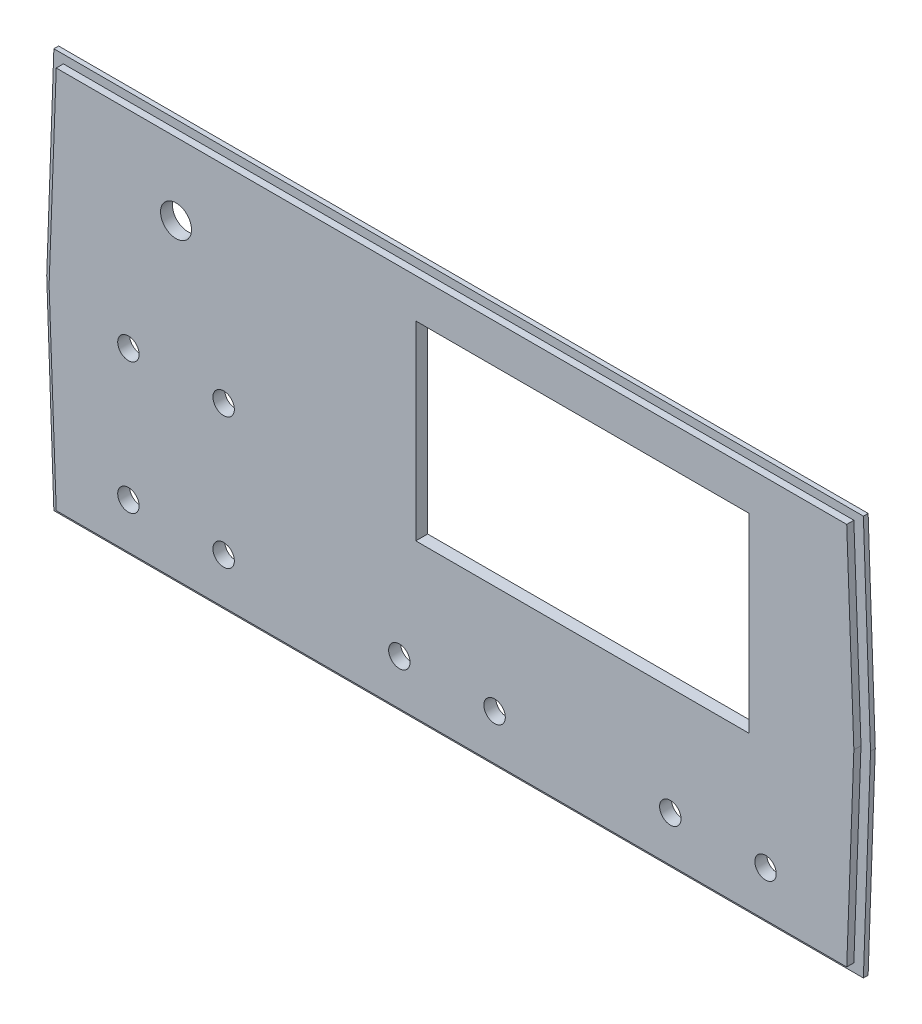
ISO-10303-21;
HEADER;
FILE_DESCRIPTION(('STEP AP214'),'2;1');
FILE_NAME('part.step','',(''),(''),'','','');
FILE_SCHEMA(('AUTOMOTIVE_DESIGN { 1 0 10303 214 1 1 1 1 }'));
ENDSEC;
DATA;
#1=APPLICATION_CONTEXT('core data for automotive mechanical design processes');
#2=APPLICATION_PROTOCOL_DEFINITION('international standard','automotive_design',2000,#1);
#3=PRODUCT_CONTEXT('',#1,'mechanical');
#4=PRODUCT('Part','Part','',(#3));
#5=PRODUCT_RELATED_PRODUCT_CATEGORY('part','',(#4));
#6=PRODUCT_DEFINITION_FORMATION('','',#4);
#7=PRODUCT_DEFINITION_CONTEXT('part definition',#1,'design');
#8=PRODUCT_DEFINITION('design','',#6,#7);
#9=PRODUCT_DEFINITION_SHAPE('','',#8);
#10=(LENGTH_UNIT() NAMED_UNIT(*) SI_UNIT(.MILLI.,.METRE.));
#11=(NAMED_UNIT(*) PLANE_ANGLE_UNIT() SI_UNIT($,.RADIAN.));
#12=(NAMED_UNIT(*) SI_UNIT($,.STERADIAN.) SOLID_ANGLE_UNIT());
#13=UNCERTAINTY_MEASURE_WITH_UNIT(LENGTH_MEASURE(1.E-05),#10,'distance_accuracy_value','');
#14=(GEOMETRIC_REPRESENTATION_CONTEXT(3) GLOBAL_UNCERTAINTY_ASSIGNED_CONTEXT((#13)) GLOBAL_UNIT_ASSIGNED_CONTEXT((#10,
#11,#12)) REPRESENTATION_CONTEXT('',''));
#15=CARTESIAN_POINT('',(0.,0.,0.));
#16=DIRECTION('',(0.,0.,1.));
#17=DIRECTION('',(1.,0.,0.));
#18=AXIS2_PLACEMENT_3D('',#15,#16,#17);
#19=CARTESIAN_POINT('',(0.,0.,1.));
#20=DIRECTION('',(0.,0.,-1.));
#21=DIRECTION('',(-1.,0.,0.));
#22=AXIS2_PLACEMENT_3D('',#19,#20,#21);
#23=PLANE('',#22);
#24=DIRECTION('',(0.0356915305124112,0.99936285434755,0.));
#25=VECTOR('',#24,1.);
#26=CARTESIAN_POINT('',(85.,-42.,1.));
#27=LINE('',#26,#25);
#28=CARTESIAN_POINT('',(85.,-42.,1.));
#29=VERTEX_POINT('',#28);
#30=CARTESIAN_POINT('',(86.5,0.,1.));
#31=VERTEX_POINT('',#30);
#32=EDGE_CURVE('E228',#29,#31,#27,.T.);
#33=ORIENTED_EDGE('',*,*,#32,.T.);
#34=DIRECTION('',(-0.0356915305124112,0.99936285434755,0.));
#35=VECTOR('',#34,1.);
#36=CARTESIAN_POINT('',(85.,42.,1.));
#37=LINE('',#36,#35);
#38=CARTESIAN_POINT('',(85.,42.,1.));
#39=VERTEX_POINT('',#38);
#40=EDGE_CURVE('E231',#31,#39,#37,.T.);
#41=ORIENTED_EDGE('',*,*,#40,.T.);
#42=DIRECTION('',(-1.,0.,0.));
#43=VECTOR('',#42,1.);
#44=CARTESIAN_POINT('',(-85.,42.,1.));
#45=LINE('',#44,#43);
#46=CARTESIAN_POINT('',(-85.,42.,1.));
#47=VERTEX_POINT('',#46);
#48=EDGE_CURVE('E234',#39,#47,#45,.T.);
#49=ORIENTED_EDGE('',*,*,#48,.T.);
#50=DIRECTION('',(-0.0356915305124132,-0.999362854347549,0.));
#51=VECTOR('',#50,1.);
#52=CARTESIAN_POINT('',(-85.,42.,1.));
#53=LINE('',#52,#51);
#54=CARTESIAN_POINT('',(-86.5,0.,1.));
#55=VERTEX_POINT('',#54);
#56=EDGE_CURVE('E236',#47,#55,#53,.T.);
#57=ORIENTED_EDGE('',*,*,#56,.T.);
#58=DIRECTION('',(0.0356915305124132,-0.99936285434755,0.));
#59=VECTOR('',#58,1.);
#60=CARTESIAN_POINT('',(-86.5,0.,1.));
#61=LINE('',#60,#59);
#62=CARTESIAN_POINT('',(-85.,-42.,1.));
#63=VERTEX_POINT('',#62);
#64=EDGE_CURVE('E238',#55,#63,#61,.T.);
#65=ORIENTED_EDGE('',*,*,#64,.T.);
#66=DIRECTION('',(1.,0.,0.));
#67=VECTOR('',#66,1.);
#68=CARTESIAN_POINT('',(-85.,-42.,1.));
#69=LINE('',#68,#67);
#70=EDGE_CURVE('E240',#63,#29,#69,.T.);
#71=ORIENTED_EDGE('',*,*,#70,.T.);
#72=EDGE_LOOP('',(#33,#41,#49,#57,#65,#71));
#73=FACE_BOUND('',#72,.T.);
#74=DIRECTION('',(0.0372412287515797,0.999306304834045,0.));
#75=VECTOR('',#74,1.);
#76=CARTESIAN_POINT('',(83.,-40.25,1.));
#77=LINE('',#76,#75);
#78=CARTESIAN_POINT('',(83.,-40.25,1.));
#79=VERTEX_POINT('',#78);
#80=CARTESIAN_POINT('',(84.5,0.,1.));
#81=VERTEX_POINT('',#80);
#82=EDGE_CURVE('E176',#79,#81,#77,.T.);
#83=ORIENTED_EDGE('',*,*,#82,.F.);
#84=DIRECTION('',(1.,0.,0.));
#85=VECTOR('',#84,1.);
#86=CARTESIAN_POINT('',(-83.,-40.25,1.));
#87=LINE('',#86,#85);
#88=CARTESIAN_POINT('',(-83.,-40.25,1.));
#89=VERTEX_POINT('',#88);
#90=EDGE_CURVE('E183',#89,#79,#87,.T.);
#91=ORIENTED_EDGE('',*,*,#90,.F.);
#92=DIRECTION('',(0.037241228751579,-0.999306304834044,0.));
#93=VECTOR('',#92,1.);
#94=CARTESIAN_POINT('',(-83.,-40.25,1.));
#95=LINE('',#94,#93);
#96=CARTESIAN_POINT('',(-84.5,0.,1.));
#97=VERTEX_POINT('',#96);
#98=EDGE_CURVE('E205',#97,#89,#95,.T.);
#99=ORIENTED_EDGE('',*,*,#98,.F.);
#100=DIRECTION('',(-0.037241228751579,-0.999306304834044,0.));
#101=VECTOR('',#100,1.);
#102=CARTESIAN_POINT('',(-84.5,0.,1.));
#103=LINE('',#102,#101);
#104=CARTESIAN_POINT('',(-83.,40.25,1.));
#105=VERTEX_POINT('',#104);
#106=EDGE_CURVE('E202',#105,#97,#103,.T.);
#107=ORIENTED_EDGE('',*,*,#106,.F.);
#108=DIRECTION('',(-1.,0.,0.));
#109=VECTOR('',#108,1.);
#110=CARTESIAN_POINT('',(-83.,40.25,1.));
#111=LINE('',#110,#109);
#112=CARTESIAN_POINT('',(83.,40.25,1.));
#113=VERTEX_POINT('',#112);
#114=EDGE_CURVE('E199',#113,#105,#111,.T.);
#115=ORIENTED_EDGE('',*,*,#114,.F.);
#116=DIRECTION('',(-0.0372412287515797,0.999306304834045,0.));
#117=VECTOR('',#116,1.);
#118=CARTESIAN_POINT('',(84.5,0.,1.));
#119=LINE('',#118,#117);
#120=EDGE_CURVE('E196',#81,#113,#119,.T.);
#121=ORIENTED_EDGE('',*,*,#120,.F.);
#122=EDGE_LOOP('',(#83,#91,#99,#107,#115,#121));
#123=FACE_BOUND('',#122,.T.);
#124=ADVANCED_FACE('F35',(#73,#123),#23,.F.);
#125=CARTESIAN_POINT('',(85.,-42.,1.));
#126=DIRECTION('',(-0.99936285434755,0.0356915305124112,0.));
#127=DIRECTION('',(-0.0356915305124112,-0.99936285434755,0.));
#128=AXIS2_PLACEMENT_3D('',#125,#126,#127);
#129=PLANE('',#128);
#130=DIRECTION('',(0.0356915305124112,0.99936285434755,0.));
#131=VECTOR('',#130,1.);
#132=CARTESIAN_POINT('',(85.,-42.,0.));
#133=LINE('',#132,#131);
#134=CARTESIAN_POINT('',(85.,-42.,0.));
#135=VERTEX_POINT('',#134);
#136=CARTESIAN_POINT('',(86.5,0.,0.));
#137=VERTEX_POINT('',#136);
#138=EDGE_CURVE('E227',#135,#137,#133,.T.);
#139=ORIENTED_EDGE('',*,*,#138,.T.);
#140=DIRECTION('',(0.,0.,-1.));
#141=VECTOR('',#140,1.);
#142=CARTESIAN_POINT('',(86.5,0.,1.));
#143=LINE('',#142,#141);
#144=EDGE_CURVE('E268',#31,#137,#143,.T.);
#145=ORIENTED_EDGE('',*,*,#144,.F.);
#146=ORIENTED_EDGE('',*,*,#32,.F.);
#147=DIRECTION('',(0.,0.,-1.));
#148=VECTOR('',#147,1.);
#149=CARTESIAN_POINT('',(85.,-42.,1.));
#150=LINE('',#149,#148);
#151=EDGE_CURVE('E242',#29,#135,#150,.T.);
#152=ORIENTED_EDGE('',*,*,#151,.T.);
#153=EDGE_LOOP('',(#139,#145,#146,#152));
#154=FACE_BOUND('',#153,.T.);
#155=ADVANCED_FACE('F37',(#154),#129,.F.);
#156=CARTESIAN_POINT('',(85.,42.,1.));
#157=DIRECTION('',(-0.99936285434755,-0.0356915305124112,0.));
#158=DIRECTION('',(0.0356915305124112,-0.99936285434755,0.));
#159=AXIS2_PLACEMENT_3D('',#156,#157,#158);
#160=PLANE('',#159);
#161=DIRECTION('',(-0.0356915305124112,0.99936285434755,0.));
#162=VECTOR('',#161,1.);
#163=CARTESIAN_POINT('',(85.,42.,0.));
#164=LINE('',#163,#162);
#165=CARTESIAN_POINT('',(85.,42.,0.));
#166=VERTEX_POINT('',#165);
#167=EDGE_CURVE('E245',#137,#166,#164,.T.);
#168=ORIENTED_EDGE('',*,*,#167,.T.);
#169=DIRECTION('',(0.,0.,-1.));
#170=VECTOR('',#169,1.);
#171=CARTESIAN_POINT('',(85.,42.,1.));
#172=LINE('',#171,#170);
#173=EDGE_CURVE('E265',#39,#166,#172,.T.);
#174=ORIENTED_EDGE('',*,*,#173,.F.);
#175=ORIENTED_EDGE('',*,*,#40,.F.);
#176=ORIENTED_EDGE('',*,*,#144,.T.);
#177=EDGE_LOOP('',(#168,#174,#175,#176));
#178=FACE_BOUND('',#177,.T.);
#179=ADVANCED_FACE('F357',(#178),#160,.F.);
#180=CARTESIAN_POINT('',(-85.,42.,1.));
#181=DIRECTION('',(0.,-1.,0.));
#182=DIRECTION('',(0.,0.,-1.));
#183=AXIS2_PLACEMENT_3D('',#180,#181,#182);
#184=PLANE('',#183);
#185=DIRECTION('',(-1.,0.,0.));
#186=VECTOR('',#185,1.);
#187=CARTESIAN_POINT('',(-85.,42.,0.));
#188=LINE('',#187,#186);
#189=CARTESIAN_POINT('',(-85.,42.,0.));
#190=VERTEX_POINT('',#189);
#191=EDGE_CURVE('E247',#166,#190,#188,.T.);
#192=ORIENTED_EDGE('',*,*,#191,.T.);
#193=DIRECTION('',(0.,0.,-1.));
#194=VECTOR('',#193,1.);
#195=CARTESIAN_POINT('',(-85.,42.,1.));
#196=LINE('',#195,#194);
#197=EDGE_CURVE('E262',#47,#190,#196,.T.);
#198=ORIENTED_EDGE('',*,*,#197,.F.);
#199=ORIENTED_EDGE('',*,*,#48,.F.);
#200=ORIENTED_EDGE('',*,*,#173,.T.);
#201=EDGE_LOOP('',(#192,#198,#199,#200));
#202=FACE_BOUND('',#201,.T.);
#203=ADVANCED_FACE('F572',(#202),#184,.F.);
#204=CARTESIAN_POINT('',(-85.,42.,1.));
#205=DIRECTION('',(0.999362854347549,-0.0356915305124132,0.));
#206=DIRECTION('',(0.0356915305124132,0.99936285434755,0.));
#207=AXIS2_PLACEMENT_3D('',#204,#205,#206);
#208=PLANE('',#207);
#209=DIRECTION('',(-0.0356915305124132,-0.999362854347549,0.));
#210=VECTOR('',#209,1.);
#211=CARTESIAN_POINT('',(-85.,42.,0.));
#212=LINE('',#211,#210);
#213=CARTESIAN_POINT('',(-86.5,0.,0.));
#214=VERTEX_POINT('',#213);
#215=EDGE_CURVE('E249',#190,#214,#212,.T.);
#216=ORIENTED_EDGE('',*,*,#215,.T.);
#217=DIRECTION('',(0.,0.,-1.));
#218=VECTOR('',#217,1.);
#219=CARTESIAN_POINT('',(-86.5,0.,1.));
#220=LINE('',#219,#218);
#221=EDGE_CURVE('E259',#55,#214,#220,.T.);
#222=ORIENTED_EDGE('',*,*,#221,.F.);
#223=ORIENTED_EDGE('',*,*,#56,.F.);
#224=ORIENTED_EDGE('',*,*,#197,.T.);
#225=EDGE_LOOP('',(#216,#222,#223,#224));
#226=FACE_BOUND('',#225,.T.);
#227=ADVANCED_FACE('F562',(#226),#208,.F.);
#228=CARTESIAN_POINT('',(-86.5,0.,1.));
#229=DIRECTION('',(0.999362854347549,0.0356915305124132,0.));
#230=DIRECTION('',(-0.0356915305124132,0.99936285434755,0.));
#231=AXIS2_PLACEMENT_3D('',#228,#229,#230);
#232=PLANE('',#231);
#233=DIRECTION('',(0.0356915305124132,-0.99936285434755,0.));
#234=VECTOR('',#233,1.);
#235=CARTESIAN_POINT('',(-86.5,0.,0.));
#236=LINE('',#235,#234);
#237=CARTESIAN_POINT('',(-85.,-42.,0.));
#238=VERTEX_POINT('',#237);
#239=EDGE_CURVE('E251',#214,#238,#236,.T.);
#240=ORIENTED_EDGE('',*,*,#239,.T.);
#241=DIRECTION('',(0.,0.,-1.));
#242=VECTOR('',#241,1.);
#243=CARTESIAN_POINT('',(-85.,-42.,1.));
#244=LINE('',#243,#242);
#245=EDGE_CURVE('E256',#63,#238,#244,.T.);
#246=ORIENTED_EDGE('',*,*,#245,.F.);
#247=ORIENTED_EDGE('',*,*,#64,.F.);
#248=ORIENTED_EDGE('',*,*,#221,.T.);
#249=EDGE_LOOP('',(#240,#246,#247,#248));
#250=FACE_BOUND('',#249,.T.);
#251=ADVANCED_FACE('F346',(#250),#232,.F.);
#252=CARTESIAN_POINT('',(-85.,-42.,1.));
#253=DIRECTION('',(0.,1.,0.));
#254=DIRECTION('',(0.,0.,1.));
#255=AXIS2_PLACEMENT_3D('',#252,#253,#254);
#256=PLANE('',#255);
#257=DIRECTION('',(1.,0.,0.));
#258=VECTOR('',#257,1.);
#259=CARTESIAN_POINT('',(-85.,-42.,0.));
#260=LINE('',#259,#258);
#261=EDGE_CURVE('E232',#238,#135,#260,.T.);
#262=ORIENTED_EDGE('',*,*,#261,.T.);
#263=ORIENTED_EDGE('',*,*,#151,.F.);
#264=ORIENTED_EDGE('',*,*,#70,.F.);
#265=ORIENTED_EDGE('',*,*,#245,.T.);
#266=EDGE_LOOP('',(#262,#263,#264,#265));
#267=FACE_BOUND('',#266,.T.);
#268=ADVANCED_FACE('F336',(#267),#256,.F.);
#269=CARTESIAN_POINT('',(0.,0.,0.));
#270=DIRECTION('',(0.,0.,-1.));
#271=DIRECTION('',(-1.,0.,0.));
#272=AXIS2_PLACEMENT_3D('',#269,#270,#271);
#273=PLANE('',#272);
#274=CARTESIAN_POINT('',(-57.8450229364827,25.0440656120589,0.));
#275=DIRECTION('',(0.,0.,-1.));
#276=DIRECTION('',(-1.,0.,0.));
#277=AXIS2_PLACEMENT_3D('',#274,#275,#276);
#278=CIRCLE('',#277,3.25);
#279=CARTESIAN_POINT('',(-61.0950229364827,25.0440656120589,0.));
#280=VERTEX_POINT('',#279);
#281=EDGE_CURVE('E315',#280,#280,#278,.T.);
#282=ORIENTED_EDGE('',*,*,#281,.F.);
#283=EDGE_LOOP('',(#282));
#284=FACE_BOUND('',#283,.T.);
#285=CARTESIAN_POINT('',(-47.8450229364827,-3.14196392407834,0.));
#286=DIRECTION('',(0.,0.,-1.));
#287=DIRECTION('',(-1.,0.,0.));
#288=AXIS2_PLACEMENT_3D('',#285,#286,#287);
#289=CIRCLE('',#288,2.25);
#290=CARTESIAN_POINT('',(-50.0950229364827,-3.14196392407834,0.));
#291=VERTEX_POINT('',#290);
#292=EDGE_CURVE('E305',#291,#291,#289,.T.);
#293=ORIENTED_EDGE('',*,*,#292,.F.);
#294=EDGE_LOOP('',(#293));
#295=FACE_BOUND('',#294,.T.);
#296=CARTESIAN_POINT('',(-67.8450229364827,-3.14196392407834,0.));
#297=DIRECTION('',(0.,0.,-1.));
#298=DIRECTION('',(-1.,0.,0.));
#299=AXIS2_PLACEMENT_3D('',#296,#297,#298);
#300=CIRCLE('',#299,2.25);
#301=CARTESIAN_POINT('',(-70.0950229364827,-3.14196392407834,0.));
#302=VERTEX_POINT('',#301);
#303=EDGE_CURVE('E302',#302,#302,#300,.T.);
#304=ORIENTED_EDGE('',*,*,#303,.F.);
#305=EDGE_LOOP('',(#304));
#306=FACE_BOUND('',#305,.T.);
#307=CARTESIAN_POINT('',(-67.8450229364827,-30.7059343879411,0.));
#308=DIRECTION('',(0.,0.,-1.));
#309=DIRECTION('',(-1.,0.,0.));
#310=AXIS2_PLACEMENT_3D('',#307,#308,#309);
#311=CIRCLE('',#310,2.25);
#312=CARTESIAN_POINT('',(-70.0950229364827,-30.7059343879411,0.));
#313=VERTEX_POINT('',#312);
#314=EDGE_CURVE('E299',#313,#313,#311,.T.);
#315=ORIENTED_EDGE('',*,*,#314,.F.);
#316=EDGE_LOOP('',(#315));
#317=FACE_BOUND('',#316,.T.);
#318=CARTESIAN_POINT('',(-47.8450229364827,-30.7059343879411,0.));
#319=DIRECTION('',(0.,0.,-1.));
#320=DIRECTION('',(-1.,0.,0.));
#321=AXIS2_PLACEMENT_3D('',#318,#319,#320);
#322=CIRCLE('',#321,2.25);
#323=CARTESIAN_POINT('',(-50.0950229364827,-30.7059343879411,0.));
#324=VERTEX_POINT('',#323);
#325=EDGE_CURVE('E295',#324,#324,#322,.T.);
#326=ORIENTED_EDGE('',*,*,#325,.F.);
#327=EDGE_LOOP('',(#326));
#328=FACE_BOUND('',#327,.T.);
#329=CARTESIAN_POINT('',(-10.9453043424043,-30.7059343879411,0.));
#330=DIRECTION('',(0.,0.,-1.));
#331=DIRECTION('',(-1.,0.,0.));
#332=AXIS2_PLACEMENT_3D('',#329,#330,#331);
#333=CIRCLE('',#332,2.25);
#334=CARTESIAN_POINT('',(-13.1953043424043,-30.7059343879411,0.));
#335=VERTEX_POINT('',#334);
#336=EDGE_CURVE('E291',#335,#335,#333,.T.);
#337=ORIENTED_EDGE('',*,*,#336,.F.);
#338=EDGE_LOOP('',(#337));
#339=FACE_BOUND('',#338,.T.);
#340=CARTESIAN_POINT('',(9.05469565759573,-30.7059343879411,0.));
#341=DIRECTION('',(0.,0.,-1.));
#342=DIRECTION('',(-1.,0.,0.));
#343=AXIS2_PLACEMENT_3D('',#340,#341,#342);
#344=CIRCLE('',#343,2.25);
#345=CARTESIAN_POINT('',(6.80469565759574,-30.7059343879411,0.));
#346=VERTEX_POINT('',#345);
#347=EDGE_CURVE('E287',#346,#346,#344,.T.);
#348=ORIENTED_EDGE('',*,*,#347,.F.);
#349=EDGE_LOOP('',(#348));
#350=FACE_BOUND('',#349,.T.);
#351=CARTESIAN_POINT('',(45.9546956575957,-30.7059343879411,0.));
#352=DIRECTION('',(0.,0.,-1.));
#353=DIRECTION('',(-1.,0.,0.));
#354=AXIS2_PLACEMENT_3D('',#351,#352,#353);
#355=CIRCLE('',#354,2.25);
#356=CARTESIAN_POINT('',(43.7046956575957,-30.7059343879411,0.));
#357=VERTEX_POINT('',#356);
#358=EDGE_CURVE('E283',#357,#357,#355,.T.);
#359=ORIENTED_EDGE('',*,*,#358,.F.);
#360=EDGE_LOOP('',(#359));
#361=FACE_BOUND('',#360,.T.);
#362=CARTESIAN_POINT('',(65.9546956575957,-30.7059343879411,0.));
#363=DIRECTION('',(0.,0.,-1.));
#364=DIRECTION('',(-1.,0.,0.));
#365=AXIS2_PLACEMENT_3D('',#362,#363,#364);
#366=CIRCLE('',#365,2.25);
#367=CARTESIAN_POINT('',(63.7046956575957,-30.7059343879411,0.));
#368=VERTEX_POINT('',#367);
#369=EDGE_CURVE('E279',#368,#368,#366,.T.);
#370=ORIENTED_EDGE('',*,*,#369,.F.);
#371=EDGE_LOOP('',(#370));
#372=FACE_BOUND('',#371,.T.);
#373=DIRECTION('',(0.,1.,0.));
#374=VECTOR('',#373,1.);
#375=CARTESIAN_POINT('',(-7.49999999999995,32.,0.));
#376=LINE('',#375,#374);
#377=CARTESIAN_POINT('',(-7.49999999999995,-8.,0.));
#378=VERTEX_POINT('',#377);
#379=CARTESIAN_POINT('',(-7.49999999999995,32.,0.));
#380=VERTEX_POINT('',#379);
#381=EDGE_CURVE('E52',#378,#380,#376,.T.);
#382=ORIENTED_EDGE('',*,*,#381,.F.);
#383=DIRECTION('',(-1.,0.,0.));
#384=VECTOR('',#383,1.);
#385=CARTESIAN_POINT('',(62.5000000000001,-8.,0.));
#386=LINE('',#385,#384);
#387=CARTESIAN_POINT('',(62.5000000000001,-8.,0.));
#388=VERTEX_POINT('',#387);
#389=EDGE_CURVE('E169',#388,#378,#386,.T.);
#390=ORIENTED_EDGE('',*,*,#389,.F.);
#391=DIRECTION('',(0.,-1.,0.));
#392=VECTOR('',#391,1.);
#393=CARTESIAN_POINT('',(62.5000000000001,32.,0.));
#394=LINE('',#393,#392);
#395=CARTESIAN_POINT('',(62.5000000000001,32.,0.));
#396=VERTEX_POINT('',#395);
#397=EDGE_CURVE('E153',#396,#388,#394,.T.);
#398=ORIENTED_EDGE('',*,*,#397,.F.);
#399=DIRECTION('',(1.,0.,0.));
#400=VECTOR('',#399,1.);
#401=CARTESIAN_POINT('',(62.5000000000001,32.,0.));
#402=LINE('',#401,#400);
#403=EDGE_CURVE('E162',#380,#396,#402,.T.);
#404=ORIENTED_EDGE('',*,*,#403,.F.);
#405=EDGE_LOOP('',(#382,#390,#398,#404));
#406=FACE_BOUND('',#405,.T.);
#407=ORIENTED_EDGE('',*,*,#138,.F.);
#408=ORIENTED_EDGE('',*,*,#261,.F.);
#409=ORIENTED_EDGE('',*,*,#239,.F.);
#410=ORIENTED_EDGE('',*,*,#215,.F.);
#411=ORIENTED_EDGE('',*,*,#191,.F.);
#412=ORIENTED_EDGE('',*,*,#167,.F.);
#413=EDGE_LOOP('',(#407,#408,#409,#410,#411,#412));
#414=FACE_BOUND('',#413,.T.);
#415=ADVANCED_FACE('F166',(#284,#295,#306,#317,#328,#339,#350,#361,#372,#406,#414),#273,.T.);
#416=CARTESIAN_POINT('',(83.,-40.25,2.5));
#417=DIRECTION('',(-0.999306304834044,0.0372412287515797,0.));
#418=DIRECTION('',(-0.0372412287515797,-0.999306304834045,0.));
#419=AXIS2_PLACEMENT_3D('',#416,#417,#418);
#420=PLANE('',#419);
#421=ORIENTED_EDGE('',*,*,#82,.T.);
#422=DIRECTION('',(0.,0.,-1.));
#423=VECTOR('',#422,1.);
#424=CARTESIAN_POINT('',(84.5,0.,2.5));
#425=LINE('',#424,#423);
#426=CARTESIAN_POINT('',(84.5,0.,2.5));
#427=VERTEX_POINT('',#426);
#428=EDGE_CURVE('E224',#427,#81,#425,.T.);
#429=ORIENTED_EDGE('',*,*,#428,.F.);
#430=DIRECTION('',(0.0372412287515797,0.999306304834045,0.));
#431=VECTOR('',#430,1.);
#432=CARTESIAN_POINT('',(83.,-40.25,2.5));
#433=LINE('',#432,#431);
#434=CARTESIAN_POINT('',(83.,-40.25,2.5));
#435=VERTEX_POINT('',#434);
#436=EDGE_CURVE('E179',#435,#427,#433,.T.);
#437=ORIENTED_EDGE('',*,*,#436,.F.);
#438=DIRECTION('',(0.,0.,-1.));
#439=VECTOR('',#438,1.);
#440=CARTESIAN_POINT('',(83.,-40.25,2.5));
#441=LINE('',#440,#439);
#442=EDGE_CURVE('E193',#435,#79,#441,.T.);
#443=ORIENTED_EDGE('',*,*,#442,.T.);
#444=EDGE_LOOP('',(#421,#429,#437,#443));
#445=FACE_BOUND('',#444,.T.);
#446=ADVANCED_FACE('F335',(#445),#420,.F.);
#447=CARTESIAN_POINT('',(84.5,0.,2.5));
#448=DIRECTION('',(-0.999306304834044,-0.0372412287515797,0.));
#449=DIRECTION('',(0.0372412287515797,-0.999306304834045,0.));
#450=AXIS2_PLACEMENT_3D('',#447,#448,#449);
#451=PLANE('',#450);
#452=ORIENTED_EDGE('',*,*,#120,.T.);
#453=DIRECTION('',(0.,0.,-1.));
#454=VECTOR('',#453,1.);
#455=CARTESIAN_POINT('',(83.,40.25,2.5));
#456=LINE('',#455,#454);
#457=CARTESIAN_POINT('',(83.,40.25,2.5));
#458=VERTEX_POINT('',#457);
#459=EDGE_CURVE('E221',#458,#113,#456,.T.);
#460=ORIENTED_EDGE('',*,*,#459,.F.);
#461=DIRECTION('',(-0.0372412287515797,0.999306304834045,0.));
#462=VECTOR('',#461,1.);
#463=CARTESIAN_POINT('',(84.5,0.,2.5));
#464=LINE('',#463,#462);
#465=EDGE_CURVE('E182',#427,#458,#464,.T.);
#466=ORIENTED_EDGE('',*,*,#465,.F.);
#467=ORIENTED_EDGE('',*,*,#428,.T.);
#468=EDGE_LOOP('',(#452,#460,#466,#467));
#469=FACE_BOUND('',#468,.T.);
#470=ADVANCED_FACE('F343',(#469),#451,.F.);
#471=CARTESIAN_POINT('',(-83.,40.25,2.5));
#472=DIRECTION('',(0.,-1.,0.));
#473=DIRECTION('',(0.,0.,-1.));
#474=AXIS2_PLACEMENT_3D('',#471,#472,#473);
#475=PLANE('',#474);
#476=ORIENTED_EDGE('',*,*,#114,.T.);
#477=DIRECTION('',(0.,0.,-1.));
#478=VECTOR('',#477,1.);
#479=CARTESIAN_POINT('',(-83.,40.25,2.5));
#480=LINE('',#479,#478);
#481=CARTESIAN_POINT('',(-83.,40.25,2.5));
#482=VERTEX_POINT('',#481);
#483=EDGE_CURVE('E218',#482,#105,#480,.T.);
#484=ORIENTED_EDGE('',*,*,#483,.F.);
#485=DIRECTION('',(-1.,0.,0.));
#486=VECTOR('',#485,1.);
#487=CARTESIAN_POINT('',(-83.,40.25,2.5));
#488=LINE('',#487,#486);
#489=EDGE_CURVE('E185',#458,#482,#488,.T.);
#490=ORIENTED_EDGE('',*,*,#489,.F.);
#491=ORIENTED_EDGE('',*,*,#459,.T.);
#492=EDGE_LOOP('',(#476,#484,#490,#491));
#493=FACE_BOUND('',#492,.T.);
#494=ADVANCED_FACE('F363',(#493),#475,.F.);
#495=CARTESIAN_POINT('',(-84.5,0.,2.5));
#496=DIRECTION('',(0.999306304834045,-0.037241228751579,0.));
#497=DIRECTION('',(0.037241228751579,0.999306304834045,0.));
#498=AXIS2_PLACEMENT_3D('',#495,#496,#497);
#499=PLANE('',#498);
#500=ORIENTED_EDGE('',*,*,#106,.T.);
#501=DIRECTION('',(0.,0.,-1.));
#502=VECTOR('',#501,1.);
#503=CARTESIAN_POINT('',(-84.5,0.,2.5));
#504=LINE('',#503,#502);
#505=CARTESIAN_POINT('',(-84.5,0.,2.5));
#506=VERTEX_POINT('',#505);
#507=EDGE_CURVE('E215',#506,#97,#504,.T.);
#508=ORIENTED_EDGE('',*,*,#507,.F.);
#509=DIRECTION('',(-0.037241228751579,-0.999306304834044,0.));
#510=VECTOR('',#509,1.);
#511=CARTESIAN_POINT('',(-84.5,0.,2.5));
#512=LINE('',#511,#510);
#513=EDGE_CURVE('E187',#482,#506,#512,.T.);
#514=ORIENTED_EDGE('',*,*,#513,.F.);
#515=ORIENTED_EDGE('',*,*,#483,.T.);
#516=EDGE_LOOP('',(#500,#508,#514,#515));
#517=FACE_BOUND('',#516,.T.);
#518=ADVANCED_FACE('F367',(#517),#499,.F.);
#519=CARTESIAN_POINT('',(-83.,-40.25,2.5));
#520=DIRECTION('',(0.999306304834045,0.037241228751579,0.));
#521=DIRECTION('',(-0.037241228751579,0.999306304834045,0.));
#522=AXIS2_PLACEMENT_3D('',#519,#520,#521);
#523=PLANE('',#522);
#524=ORIENTED_EDGE('',*,*,#98,.T.);
#525=DIRECTION('',(0.,0.,-1.));
#526=VECTOR('',#525,1.);
#527=CARTESIAN_POINT('',(-83.,-40.25,2.5));
#528=LINE('',#527,#526);
#529=CARTESIAN_POINT('',(-83.,-40.25,2.5));
#530=VERTEX_POINT('',#529);
#531=EDGE_CURVE('E212',#530,#89,#528,.T.);
#532=ORIENTED_EDGE('',*,*,#531,.F.);
#533=DIRECTION('',(0.037241228751579,-0.999306304834044,0.));
#534=VECTOR('',#533,1.);
#535=CARTESIAN_POINT('',(-83.,-40.25,2.5));
#536=LINE('',#535,#534);
#537=EDGE_CURVE('E189',#506,#530,#536,.T.);
#538=ORIENTED_EDGE('',*,*,#537,.F.);
#539=ORIENTED_EDGE('',*,*,#507,.T.);
#540=EDGE_LOOP('',(#524,#532,#538,#539));
#541=FACE_BOUND('',#540,.T.);
#542=ADVANCED_FACE('F371',(#541),#523,.F.);
#543=CARTESIAN_POINT('',(-83.,-40.25,2.5));
#544=DIRECTION('',(0.,1.,0.));
#545=DIRECTION('',(0.,0.,1.));
#546=AXIS2_PLACEMENT_3D('',#543,#544,#545);
#547=PLANE('',#546);
#548=ORIENTED_EDGE('',*,*,#90,.T.);
#549=ORIENTED_EDGE('',*,*,#442,.F.);
#550=DIRECTION('',(1.,0.,0.));
#551=VECTOR('',#550,1.);
#552=CARTESIAN_POINT('',(-83.,-40.25,2.5));
#553=LINE('',#552,#551);
#554=EDGE_CURVE('E191',#530,#435,#553,.T.);
#555=ORIENTED_EDGE('',*,*,#554,.F.);
#556=ORIENTED_EDGE('',*,*,#531,.T.);
#557=EDGE_LOOP('',(#548,#549,#555,#556));
#558=FACE_BOUND('',#557,.T.);
#559=ADVANCED_FACE('F375',(#558),#547,.F.);
#560=CARTESIAN_POINT('',(0.,0.,2.5));
#561=DIRECTION('',(0.,0.,-1.));
#562=DIRECTION('',(-1.,0.,0.));
#563=AXIS2_PLACEMENT_3D('',#560,#561,#562);
#564=PLANE('',#563);
#565=CARTESIAN_POINT('',(-57.8450229364827,25.0440656120589,2.5));
#566=DIRECTION('',(0.,0.,-1.));
#567=DIRECTION('',(-1.,0.,0.));
#568=AXIS2_PLACEMENT_3D('',#565,#566,#567);
#569=CIRCLE('',#568,3.25);
#570=CARTESIAN_POINT('',(-61.0950229364827,25.0440656120589,2.5));
#571=VERTEX_POINT('',#570);
#572=EDGE_CURVE('E39',#571,#571,#569,.T.);
#573=ORIENTED_EDGE('',*,*,#572,.T.);
#574=EDGE_LOOP('',(#573));
#575=FACE_BOUND('',#574,.T.);
#576=CARTESIAN_POINT('',(-47.8450229364827,-3.14196392407834,2.5));
#577=DIRECTION('',(0.,0.,-1.));
#578=DIRECTION('',(-1.,0.,0.));
#579=AXIS2_PLACEMENT_3D('',#576,#577,#578);
#580=CIRCLE('',#579,2.25);
#581=CARTESIAN_POINT('',(-50.0950229364827,-3.14196392407834,2.5));
#582=VERTEX_POINT('',#581);
#583=EDGE_CURVE('E303',#582,#582,#580,.T.);
#584=ORIENTED_EDGE('',*,*,#583,.T.);
#585=EDGE_LOOP('',(#584));
#586=FACE_BOUND('',#585,.T.);
#587=CARTESIAN_POINT('',(-67.8450229364827,-3.14196392407834,2.5));
#588=DIRECTION('',(0.,0.,-1.));
#589=DIRECTION('',(-1.,0.,0.));
#590=AXIS2_PLACEMENT_3D('',#587,#588,#589);
#591=CIRCLE('',#590,2.25);
#592=CARTESIAN_POINT('',(-70.0950229364827,-3.14196392407834,2.5));
#593=VERTEX_POINT('',#592);
#594=EDGE_CURVE('E300',#593,#593,#591,.T.);
#595=ORIENTED_EDGE('',*,*,#594,.T.);
#596=EDGE_LOOP('',(#595));
#597=FACE_BOUND('',#596,.T.);
#598=CARTESIAN_POINT('',(-67.8450229364827,-30.7059343879411,2.5));
#599=DIRECTION('',(0.,0.,-1.));
#600=DIRECTION('',(-1.,0.,0.));
#601=AXIS2_PLACEMENT_3D('',#598,#599,#600);
#602=CIRCLE('',#601,2.25);
#603=CARTESIAN_POINT('',(-70.0950229364827,-30.7059343879411,2.5));
#604=VERTEX_POINT('',#603);
#605=EDGE_CURVE('E296',#604,#604,#602,.T.);
#606=ORIENTED_EDGE('',*,*,#605,.T.);
#607=EDGE_LOOP('',(#606));
#608=FACE_BOUND('',#607,.T.);
#609=CARTESIAN_POINT('',(-47.8450229364827,-30.7059343879411,2.5));
#610=DIRECTION('',(0.,0.,-1.));
#611=DIRECTION('',(-1.,0.,0.));
#612=AXIS2_PLACEMENT_3D('',#609,#610,#611);
#613=CIRCLE('',#612,2.25);
#614=CARTESIAN_POINT('',(-50.0950229364827,-30.7059343879411,2.5));
#615=VERTEX_POINT('',#614);
#616=EDGE_CURVE('E292',#615,#615,#613,.T.);
#617=ORIENTED_EDGE('',*,*,#616,.T.);
#618=EDGE_LOOP('',(#617));
#619=FACE_BOUND('',#618,.T.);
#620=CARTESIAN_POINT('',(-10.9453043424043,-30.7059343879411,2.5));
#621=DIRECTION('',(0.,0.,-1.));
#622=DIRECTION('',(-1.,0.,0.));
#623=AXIS2_PLACEMENT_3D('',#620,#621,#622);
#624=CIRCLE('',#623,2.25);
#625=CARTESIAN_POINT('',(-13.1953043424043,-30.7059343879411,2.5));
#626=VERTEX_POINT('',#625);
#627=EDGE_CURVE('E288',#626,#626,#624,.T.);
#628=ORIENTED_EDGE('',*,*,#627,.T.);
#629=EDGE_LOOP('',(#628));
#630=FACE_BOUND('',#629,.T.);
#631=CARTESIAN_POINT('',(9.05469565759573,-30.7059343879411,2.5));
#632=DIRECTION('',(0.,0.,-1.));
#633=DIRECTION('',(-1.,0.,0.));
#634=AXIS2_PLACEMENT_3D('',#631,#632,#633);
#635=CIRCLE('',#634,2.25);
#636=CARTESIAN_POINT('',(6.80469565759574,-30.7059343879411,2.5));
#637=VERTEX_POINT('',#636);
#638=EDGE_CURVE('E284',#637,#637,#635,.T.);
#639=ORIENTED_EDGE('',*,*,#638,.T.);
#640=EDGE_LOOP('',(#639));
#641=FACE_BOUND('',#640,.T.);
#642=CARTESIAN_POINT('',(45.9546956575957,-30.7059343879411,2.5));
#643=DIRECTION('',(0.,0.,-1.));
#644=DIRECTION('',(-1.,0.,0.));
#645=AXIS2_PLACEMENT_3D('',#642,#643,#644);
#646=CIRCLE('',#645,2.25);
#647=CARTESIAN_POINT('',(43.7046956575957,-30.7059343879411,2.5));
#648=VERTEX_POINT('',#647);
#649=EDGE_CURVE('E280',#648,#648,#646,.T.);
#650=ORIENTED_EDGE('',*,*,#649,.T.);
#651=EDGE_LOOP('',(#650));
#652=FACE_BOUND('',#651,.T.);
#653=CARTESIAN_POINT('',(65.9546956575957,-30.7059343879411,2.5));
#654=DIRECTION('',(0.,0.,-1.));
#655=DIRECTION('',(-1.,0.,0.));
#656=AXIS2_PLACEMENT_3D('',#653,#654,#655);
#657=CIRCLE('',#656,2.25);
#658=CARTESIAN_POINT('',(63.7046956575957,-30.7059343879411,2.5));
#659=VERTEX_POINT('',#658);
#660=EDGE_CURVE('E276',#659,#659,#657,.T.);
#661=ORIENTED_EDGE('',*,*,#660,.T.);
#662=EDGE_LOOP('',(#661));
#663=FACE_BOUND('',#662,.T.);
#664=DIRECTION('',(-1.,0.,0.));
#665=VECTOR('',#664,1.);
#666=CARTESIAN_POINT('',(0.,-8.,2.5));
#667=LINE('',#666,#665);
#668=CARTESIAN_POINT('',(62.5000000000001,-8.,2.5));
#669=VERTEX_POINT('',#668);
#670=CARTESIAN_POINT('',(-7.49999999999995,-8.,2.5));
#671=VERTEX_POINT('',#670);
#672=EDGE_CURVE('E44',#669,#671,#667,.T.);
#673=ORIENTED_EDGE('',*,*,#672,.T.);
#674=DIRECTION('',(0.,1.,0.));
#675=VECTOR('',#674,1.);
#676=CARTESIAN_POINT('',(-7.49999999999995,0.,2.5));
#677=LINE('',#676,#675);
#678=CARTESIAN_POINT('',(-7.49999999999995,32.,2.5));
#679=VERTEX_POINT('',#678);
#680=EDGE_CURVE('E11',#671,#679,#677,.T.);
#681=ORIENTED_EDGE('',*,*,#680,.T.);
#682=DIRECTION('',(1.,0.,0.));
#683=VECTOR('',#682,1.);
#684=CARTESIAN_POINT('',(0.,32.,2.5));
#685=LINE('',#684,#683);
#686=CARTESIAN_POINT('',(62.5000000000001,32.,2.5));
#687=VERTEX_POINT('',#686);
#688=EDGE_CURVE('E271',#679,#687,#685,.T.);
#689=ORIENTED_EDGE('',*,*,#688,.T.);
#690=DIRECTION('',(0.,-1.,0.));
#691=VECTOR('',#690,1.);
#692=CARTESIAN_POINT('',(62.5000000000001,0.,2.5));
#693=LINE('',#692,#691);
#694=EDGE_CURVE('E156',#687,#669,#693,.T.);
#695=ORIENTED_EDGE('',*,*,#694,.T.);
#696=EDGE_LOOP('',(#673,#681,#689,#695));
#697=FACE_BOUND('',#696,.T.);
#698=ORIENTED_EDGE('',*,*,#436,.T.);
#699=ORIENTED_EDGE('',*,*,#465,.T.);
#700=ORIENTED_EDGE('',*,*,#489,.T.);
#701=ORIENTED_EDGE('',*,*,#513,.T.);
#702=ORIENTED_EDGE('',*,*,#537,.T.);
#703=ORIENTED_EDGE('',*,*,#554,.T.);
#704=EDGE_LOOP('',(#698,#699,#700,#701,#702,#703));
#705=FACE_BOUND('',#704,.T.);
#706=ADVANCED_FACE('F379',(#575,#586,#597,#608,#619,#630,#641,#652,#663,#697,#705),#564,.F.);
#707=CARTESIAN_POINT('',(-7.49999999999995,32.,10.));
#708=DIRECTION('',(-1.,0.,0.));
#709=DIRECTION('',(0.,0.,1.));
#710=AXIS2_PLACEMENT_3D('',#707,#708,#709);
#711=PLANE('',#710);
#712=DIRECTION('',(0.,0.,-1.));
#713=VECTOR('',#712,1.);
#714=CARTESIAN_POINT('',(-7.49999999999995,-8.,10.));
#715=LINE('',#714,#713);
#716=EDGE_CURVE('E174',#671,#378,#715,.T.);
#717=ORIENTED_EDGE('',*,*,#716,.T.);
#718=ORIENTED_EDGE('',*,*,#381,.T.);
#719=DIRECTION('',(0.,0.,-1.));
#720=VECTOR('',#719,1.);
#721=CARTESIAN_POINT('',(-7.49999999999995,32.,10.));
#722=LINE('',#721,#720);
#723=EDGE_CURVE('E159',#679,#380,#722,.T.);
#724=ORIENTED_EDGE('',*,*,#723,.F.);
#725=ORIENTED_EDGE('',*,*,#680,.F.);
#726=EDGE_LOOP('',(#717,#718,#724,#725));
#727=FACE_BOUND('',#726,.T.);
#728=ADVANCED_FACE('F383',(#727),#711,.F.);
#729=CARTESIAN_POINT('',(62.5000000000001,-8.,10.));
#730=DIRECTION('',(0.,-1.,0.));
#731=DIRECTION('',(0.,0.,-1.));
#732=AXIS2_PLACEMENT_3D('',#729,#730,#731);
#733=PLANE('',#732);
#734=DIRECTION('',(0.,0.,-1.));
#735=VECTOR('',#734,1.);
#736=CARTESIAN_POINT('',(62.5000000000001,-8.,10.));
#737=LINE('',#736,#735);
#738=EDGE_CURVE('E158',#669,#388,#737,.T.);
#739=ORIENTED_EDGE('',*,*,#738,.T.);
#740=ORIENTED_EDGE('',*,*,#389,.T.);
#741=ORIENTED_EDGE('',*,*,#716,.F.);
#742=ORIENTED_EDGE('',*,*,#672,.F.);
#743=EDGE_LOOP('',(#739,#740,#741,#742));
#744=FACE_BOUND('',#743,.T.);
#745=ADVANCED_FACE('F387',(#744),#733,.F.);
#746=CARTESIAN_POINT('',(62.5000000000001,32.,10.));
#747=DIRECTION('',(1.,0.,0.));
#748=DIRECTION('',(0.,0.,-1.));
#749=AXIS2_PLACEMENT_3D('',#746,#747,#748);
#750=PLANE('',#749);
#751=DIRECTION('',(0.,0.,-1.));
#752=VECTOR('',#751,1.);
#753=CARTESIAN_POINT('',(62.5000000000001,32.,10.));
#754=LINE('',#753,#752);
#755=EDGE_CURVE('E60',#687,#396,#754,.T.);
#756=ORIENTED_EDGE('',*,*,#755,.T.);
#757=ORIENTED_EDGE('',*,*,#397,.T.);
#758=ORIENTED_EDGE('',*,*,#738,.F.);
#759=ORIENTED_EDGE('',*,*,#694,.F.);
#760=EDGE_LOOP('',(#756,#757,#758,#759));
#761=FACE_BOUND('',#760,.T.);
#762=ADVANCED_FACE('F150',(#761),#750,.F.);
#763=CARTESIAN_POINT('',(62.5000000000001,32.,10.));
#764=DIRECTION('',(0.,1.,0.));
#765=DIRECTION('',(0.,0.,1.));
#766=AXIS2_PLACEMENT_3D('',#763,#764,#765);
#767=PLANE('',#766);
#768=ORIENTED_EDGE('',*,*,#723,.T.);
#769=ORIENTED_EDGE('',*,*,#403,.T.);
#770=ORIENTED_EDGE('',*,*,#755,.F.);
#771=ORIENTED_EDGE('',*,*,#688,.F.);
#772=EDGE_LOOP('',(#768,#769,#770,#771));
#773=FACE_BOUND('',#772,.T.);
#774=ADVANCED_FACE('F163',(#773),#767,.F.);
#775=CARTESIAN_POINT('',(65.9546956575957,-30.7059343879411,10.));
#776=DIRECTION('',(0.,0.,-1.));
#777=DIRECTION('',(-1.,0.,0.));
#778=AXIS2_PLACEMENT_3D('',#775,#776,#777);
#779=CYLINDRICAL_SURFACE('',#778,2.25);
#780=ORIENTED_EDGE('',*,*,#369,.T.);
#781=EDGE_LOOP('',(#780));
#782=FACE_BOUND('',#781,.T.);
#783=ORIENTED_EDGE('',*,*,#660,.F.);
#784=EDGE_LOOP('',(#783));
#785=FACE_BOUND('',#784,.T.);
#786=ADVANCED_FACE('F331',(#782,#785),#779,.F.);
#787=CARTESIAN_POINT('',(45.9546956575957,-30.7059343879411,10.));
#788=DIRECTION('',(0.,0.,-1.));
#789=DIRECTION('',(-1.,0.,0.));
#790=AXIS2_PLACEMENT_3D('',#787,#788,#789);
#791=CYLINDRICAL_SURFACE('',#790,2.25);
#792=ORIENTED_EDGE('',*,*,#358,.T.);
#793=EDGE_LOOP('',(#792));
#794=FACE_BOUND('',#793,.T.);
#795=ORIENTED_EDGE('',*,*,#649,.F.);
#796=EDGE_LOOP('',(#795));
#797=FACE_BOUND('',#796,.T.);
#798=ADVANCED_FACE('F397',(#794,#797),#791,.F.);
#799=CARTESIAN_POINT('',(9.05469565759573,-30.7059343879411,10.));
#800=DIRECTION('',(0.,0.,-1.));
#801=DIRECTION('',(-1.,0.,0.));
#802=AXIS2_PLACEMENT_3D('',#799,#800,#801);
#803=CYLINDRICAL_SURFACE('',#802,2.25);
#804=ORIENTED_EDGE('',*,*,#347,.T.);
#805=EDGE_LOOP('',(#804));
#806=FACE_BOUND('',#805,.T.);
#807=ORIENTED_EDGE('',*,*,#638,.F.);
#808=EDGE_LOOP('',(#807));
#809=FACE_BOUND('',#808,.T.);
#810=ADVANCED_FACE('F400',(#806,#809),#803,.F.);
#811=CARTESIAN_POINT('',(-10.9453043424043,-30.7059343879411,10.));
#812=DIRECTION('',(0.,0.,-1.));
#813=DIRECTION('',(-1.,0.,0.));
#814=AXIS2_PLACEMENT_3D('',#811,#812,#813);
#815=CYLINDRICAL_SURFACE('',#814,2.25);
#816=ORIENTED_EDGE('',*,*,#336,.T.);
#817=EDGE_LOOP('',(#816));
#818=FACE_BOUND('',#817,.T.);
#819=ORIENTED_EDGE('',*,*,#627,.F.);
#820=EDGE_LOOP('',(#819));
#821=FACE_BOUND('',#820,.T.);
#822=ADVANCED_FACE('F404',(#818,#821),#815,.F.);
#823=CARTESIAN_POINT('',(-47.8450229364827,-30.7059343879411,10.));
#824=DIRECTION('',(0.,0.,-1.));
#825=DIRECTION('',(-1.,0.,0.));
#826=AXIS2_PLACEMENT_3D('',#823,#824,#825);
#827=CYLINDRICAL_SURFACE('',#826,2.25);
#828=ORIENTED_EDGE('',*,*,#325,.T.);
#829=EDGE_LOOP('',(#828));
#830=FACE_BOUND('',#829,.T.);
#831=ORIENTED_EDGE('',*,*,#616,.F.);
#832=EDGE_LOOP('',(#831));
#833=FACE_BOUND('',#832,.T.);
#834=ADVANCED_FACE('F408',(#830,#833),#827,.F.);
#835=CARTESIAN_POINT('',(-67.8450229364827,-30.7059343879411,10.));
#836=DIRECTION('',(0.,0.,-1.));
#837=DIRECTION('',(-1.,0.,0.));
#838=AXIS2_PLACEMENT_3D('',#835,#836,#837);
#839=CYLINDRICAL_SURFACE('',#838,2.25);
#840=ORIENTED_EDGE('',*,*,#314,.T.);
#841=EDGE_LOOP('',(#840));
#842=FACE_BOUND('',#841,.T.);
#843=ORIENTED_EDGE('',*,*,#605,.F.);
#844=EDGE_LOOP('',(#843));
#845=FACE_BOUND('',#844,.T.);
#846=ADVANCED_FACE('F412',(#842,#845),#839,.F.);
#847=CARTESIAN_POINT('',(-67.8450229364827,-3.14196392407834,10.));
#848=DIRECTION('',(0.,0.,-1.));
#849=DIRECTION('',(-1.,0.,0.));
#850=AXIS2_PLACEMENT_3D('',#847,#848,#849);
#851=CYLINDRICAL_SURFACE('',#850,2.25);
#852=ORIENTED_EDGE('',*,*,#303,.T.);
#853=EDGE_LOOP('',(#852));
#854=FACE_BOUND('',#853,.T.);
#855=ORIENTED_EDGE('',*,*,#594,.F.);
#856=EDGE_LOOP('',(#855));
#857=FACE_BOUND('',#856,.T.);
#858=ADVANCED_FACE('F416',(#854,#857),#851,.F.);
#859=CARTESIAN_POINT('',(-47.8450229364827,-3.14196392407834,10.));
#860=DIRECTION('',(0.,0.,-1.));
#861=DIRECTION('',(-1.,0.,0.));
#862=AXIS2_PLACEMENT_3D('',#859,#860,#861);
#863=CYLINDRICAL_SURFACE('',#862,2.25);
#864=ORIENTED_EDGE('',*,*,#292,.T.);
#865=EDGE_LOOP('',(#864));
#866=FACE_BOUND('',#865,.T.);
#867=ORIENTED_EDGE('',*,*,#583,.F.);
#868=EDGE_LOOP('',(#867));
#869=FACE_BOUND('',#868,.T.);
#870=ADVANCED_FACE('F420',(#866,#869),#863,.F.);
#871=CARTESIAN_POINT('',(-57.8450229364827,25.0440656120589,10.));
#872=DIRECTION('',(0.,0.,-1.));
#873=DIRECTION('',(-1.,0.,0.));
#874=AXIS2_PLACEMENT_3D('',#871,#872,#873);
#875=CYLINDRICAL_SURFACE('',#874,3.25);
#876=ORIENTED_EDGE('',*,*,#281,.T.);
#877=EDGE_LOOP('',(#876));
#878=FACE_BOUND('',#877,.T.);
#879=ORIENTED_EDGE('',*,*,#572,.F.);
#880=EDGE_LOOP('',(#879));
#881=FACE_BOUND('',#880,.T.);
#882=ADVANCED_FACE('F424',(#878,#881),#875,.F.);
#883=CLOSED_SHELL('',(#124,#155,#179,#203,#227,#251,#268,#415,#446,#470,#494,#518,#542,#559,
#706,#728,#745,#762,#774,#786,#798,#810,#822,#834,#846,#858,#870,#882));
#884=MANIFOLD_SOLID_BREP('B2',#883);
#885=ADVANCED_BREP_SHAPE_REPRESENTATION('',(#18,#884),#14);
#886=SHAPE_DEFINITION_REPRESENTATION(#9,#885);
ENDSEC;
END-ISO-10303-21;
